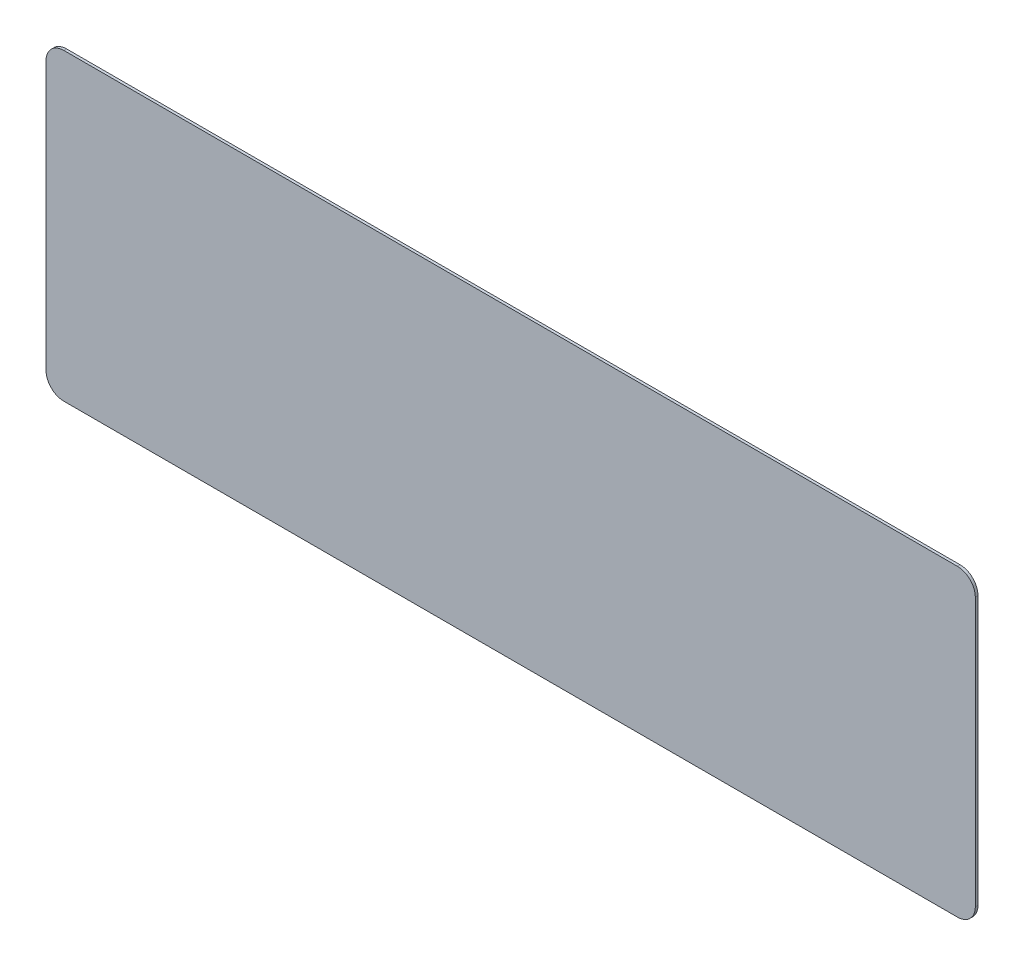
ISO-10303-21;
HEADER;
FILE_DESCRIPTION(('STEP AP214'),'2;1');
FILE_NAME('part.step','',(''),(''),'','','');
FILE_SCHEMA(('AUTOMOTIVE_DESIGN { 1 0 10303 214 1 1 1 1 }'));
ENDSEC;
DATA;
#1=APPLICATION_CONTEXT('core data for automotive mechanical design processes');
#2=APPLICATION_PROTOCOL_DEFINITION('international standard','automotive_design',2000,#1);
#3=PRODUCT_CONTEXT('',#1,'mechanical');
#4=PRODUCT('Part','Part','',(#3));
#5=PRODUCT_RELATED_PRODUCT_CATEGORY('part','',(#4));
#6=PRODUCT_DEFINITION_FORMATION('','',#4);
#7=PRODUCT_DEFINITION_CONTEXT('part definition',#1,'design');
#8=PRODUCT_DEFINITION('design','',#6,#7);
#9=PRODUCT_DEFINITION_SHAPE('','',#8);
#10=(LENGTH_UNIT() NAMED_UNIT(*) SI_UNIT(.MILLI.,.METRE.));
#11=(NAMED_UNIT(*) PLANE_ANGLE_UNIT() SI_UNIT($,.RADIAN.));
#12=(NAMED_UNIT(*) SI_UNIT($,.STERADIAN.) SOLID_ANGLE_UNIT());
#13=UNCERTAINTY_MEASURE_WITH_UNIT(LENGTH_MEASURE(1.E-05),#10,'distance_accuracy_value','');
#14=(GEOMETRIC_REPRESENTATION_CONTEXT(3) GLOBAL_UNCERTAINTY_ASSIGNED_CONTEXT((#13)) GLOBAL_UNIT_ASSIGNED_CONTEXT((#10,
#11,#12)) REPRESENTATION_CONTEXT('',''));
#15=CARTESIAN_POINT('',(0.,0.,0.));
#16=DIRECTION('',(0.,0.,1.));
#17=DIRECTION('',(1.,0.,0.));
#18=AXIS2_PLACEMENT_3D('',#15,#16,#17);
#19=CARTESIAN_POINT('',(-260.,-85.0000000000001,-1.5));
#20=DIRECTION('',(-1.,0.,0.));
#21=DIRECTION('',(0.,0.,1.));
#22=AXIS2_PLACEMENT_3D('',#19,#20,#21);
#23=PLANE('',#22);
#24=DIRECTION('',(0.,-1.,0.));
#25=VECTOR('',#24,1.);
#26=CARTESIAN_POINT('',(-260.,-85.0000000000001,0.));
#27=LINE('',#26,#25);
#28=CARTESIAN_POINT('',(-260.,75.,0.));
#29=VERTEX_POINT('',#28);
#30=CARTESIAN_POINT('',(-260.,-75.0000000000001,0.));
#31=VERTEX_POINT('',#30);
#32=EDGE_CURVE('E111',#29,#31,#27,.T.);
#33=ORIENTED_EDGE('',*,*,#32,.F.);
#34=DIRECTION('',(0.,0.,1.));
#35=VECTOR('',#34,1.);
#36=CARTESIAN_POINT('',(-260.,75.,-1.5));
#37=LINE('',#36,#35);
#38=CARTESIAN_POINT('',(-260.,75.,-1.5));
#39=VERTEX_POINT('',#38);
#40=EDGE_CURVE('E11',#29,#39,#37,.F.);
#41=ORIENTED_EDGE('',*,*,#40,.T.);
#42=DIRECTION('',(0.,-1.,0.));
#43=VECTOR('',#42,1.);
#44=CARTESIAN_POINT('',(-260.,-85.0000000000001,-1.5));
#45=LINE('',#44,#43);
#46=CARTESIAN_POINT('',(-260.,-75.0000000000001,-1.5));
#47=VERTEX_POINT('',#46);
#48=EDGE_CURVE('E161',#39,#47,#45,.T.);
#49=ORIENTED_EDGE('',*,*,#48,.T.);
#50=DIRECTION('',(0.,0.,1.));
#51=VECTOR('',#50,1.);
#52=CARTESIAN_POINT('',(-260.,-75.0000000000001,-1.5));
#53=LINE('',#52,#51);
#54=EDGE_CURVE('E48',#47,#31,#53,.T.);
#55=ORIENTED_EDGE('',*,*,#54,.T.);
#56=EDGE_LOOP('',(#33,#41,#49,#55));
#57=FACE_BOUND('',#56,.T.);
#58=ADVANCED_FACE('F40',(#57),#23,.T.);
#59=CARTESIAN_POINT('',(260.,85.,-1.5));
#60=DIRECTION('',(0.,1.,0.));
#61=DIRECTION('',(-1.,0.,0.));
#62=AXIS2_PLACEMENT_3D('',#59,#60,#61);
#63=PLANE('',#62);
#64=DIRECTION('',(-1.,0.,0.));
#65=VECTOR('',#64,1.);
#66=CARTESIAN_POINT('',(260.,85.,0.));
#67=LINE('',#66,#65);
#68=CARTESIAN_POINT('',(250.,85.,0.));
#69=VERTEX_POINT('',#68);
#70=CARTESIAN_POINT('',(-250.,84.9999999999999,0.));
#71=VERTEX_POINT('',#70);
#72=EDGE_CURVE('E136',#69,#71,#67,.T.);
#73=ORIENTED_EDGE('',*,*,#72,.F.);
#74=DIRECTION('',(0.,0.,1.));
#75=VECTOR('',#74,1.);
#76=CARTESIAN_POINT('',(250.,85.,-1.5));
#77=LINE('',#76,#75);
#78=CARTESIAN_POINT('',(250.,85.,-1.5));
#79=VERTEX_POINT('',#78);
#80=EDGE_CURVE('E62',#69,#79,#77,.F.);
#81=ORIENTED_EDGE('',*,*,#80,.T.);
#82=DIRECTION('',(-1.,0.,0.));
#83=VECTOR('',#82,1.);
#84=CARTESIAN_POINT('',(260.,85.,-1.5));
#85=LINE('',#84,#83);
#86=CARTESIAN_POINT('',(-250.,84.9999999999999,-1.5));
#87=VERTEX_POINT('',#86);
#88=EDGE_CURVE('E130',#79,#87,#85,.T.);
#89=ORIENTED_EDGE('',*,*,#88,.T.);
#90=DIRECTION('',(0.,0.,1.));
#91=VECTOR('',#90,1.);
#92=CARTESIAN_POINT('',(-250.,84.9999999999999,-1.5));
#93=LINE('',#92,#91);
#94=EDGE_CURVE('E155',#87,#71,#93,.T.);
#95=ORIENTED_EDGE('',*,*,#94,.T.);
#96=EDGE_LOOP('',(#73,#81,#89,#95));
#97=FACE_BOUND('',#96,.T.);
#98=ADVANCED_FACE('F193',(#97),#63,.T.);
#99=CARTESIAN_POINT('',(260.,-85.,-1.5));
#100=DIRECTION('',(1.,0.,0.));
#101=DIRECTION('',(0.,0.,-1.));
#102=AXIS2_PLACEMENT_3D('',#99,#100,#101);
#103=PLANE('',#102);
#104=DIRECTION('',(0.,1.,0.));
#105=VECTOR('',#104,1.);
#106=CARTESIAN_POINT('',(260.,-85.,0.));
#107=LINE('',#106,#105);
#108=CARTESIAN_POINT('',(260.,-75.,0.));
#109=VERTEX_POINT('',#108);
#110=CARTESIAN_POINT('',(260.,75.,0.));
#111=VERTEX_POINT('',#110);
#112=EDGE_CURVE('E126',#109,#111,#107,.T.);
#113=ORIENTED_EDGE('',*,*,#112,.F.);
#114=DIRECTION('',(0.,0.,1.));
#115=VECTOR('',#114,1.);
#116=CARTESIAN_POINT('',(260.,-75.,-1.5));
#117=LINE('',#116,#115);
#118=CARTESIAN_POINT('',(260.,-75.,-1.5));
#119=VERTEX_POINT('',#118);
#120=EDGE_CURVE('E147',#109,#119,#117,.F.);
#121=ORIENTED_EDGE('',*,*,#120,.T.);
#122=DIRECTION('',(0.,1.,0.));
#123=VECTOR('',#122,1.);
#124=CARTESIAN_POINT('',(260.,-85.,-1.5));
#125=LINE('',#124,#123);
#126=CARTESIAN_POINT('',(260.,75.,-1.5));
#127=VERTEX_POINT('',#126);
#128=EDGE_CURVE('E133',#119,#127,#125,.T.);
#129=ORIENTED_EDGE('',*,*,#128,.T.);
#130=DIRECTION('',(0.,0.,1.));
#131=VECTOR('',#130,1.);
#132=CARTESIAN_POINT('',(260.,75.,-1.5));
#133=LINE('',#132,#131);
#134=EDGE_CURVE('E144',#127,#111,#133,.T.);
#135=ORIENTED_EDGE('',*,*,#134,.T.);
#136=EDGE_LOOP('',(#113,#121,#129,#135));
#137=FACE_BOUND('',#136,.T.);
#138=ADVANCED_FACE('F173',(#137),#103,.T.);
#139=CARTESIAN_POINT('',(260.,-85.,-1.5));
#140=DIRECTION('',(0.,-1.,0.));
#141=DIRECTION('',(1.,0.,0.));
#142=AXIS2_PLACEMENT_3D('',#139,#140,#141);
#143=PLANE('',#142);
#144=DIRECTION('',(1.,0.,0.));
#145=VECTOR('',#144,1.);
#146=CARTESIAN_POINT('',(260.,-85.,-1.5));
#147=LINE('',#146,#145);
#148=CARTESIAN_POINT('',(-250.,-85.0000000000001,-1.5));
#149=VERTEX_POINT('',#148);
#150=CARTESIAN_POINT('',(250.,-85.,-1.5));
#151=VERTEX_POINT('',#150);
#152=EDGE_CURVE('E162',#149,#151,#147,.T.);
#153=ORIENTED_EDGE('',*,*,#152,.T.);
#154=DIRECTION('',(0.,0.,1.));
#155=VECTOR('',#154,1.);
#156=CARTESIAN_POINT('',(250.,-85.,-1.5));
#157=LINE('',#156,#155);
#158=CARTESIAN_POINT('',(250.,-85.,0.));
#159=VERTEX_POINT('',#158);
#160=EDGE_CURVE('E117',#151,#159,#157,.T.);
#161=ORIENTED_EDGE('',*,*,#160,.T.);
#162=DIRECTION('',(1.,0.,0.));
#163=VECTOR('',#162,1.);
#164=CARTESIAN_POINT('',(260.,-85.,0.));
#165=LINE('',#164,#163);
#166=CARTESIAN_POINT('',(-250.,-85.0000000000001,0.));
#167=VERTEX_POINT('',#166);
#168=EDGE_CURVE('E109',#167,#159,#165,.T.);
#169=ORIENTED_EDGE('',*,*,#168,.F.);
#170=DIRECTION('',(0.,0.,1.));
#171=VECTOR('',#170,1.);
#172=CARTESIAN_POINT('',(-250.,-85.0000000000001,-1.5));
#173=LINE('',#172,#171);
#174=EDGE_CURVE('E123',#167,#149,#173,.F.);
#175=ORIENTED_EDGE('',*,*,#174,.T.);
#176=EDGE_LOOP('',(#153,#161,#169,#175));
#177=FACE_BOUND('',#176,.T.);
#178=ADVANCED_FACE('F122',(#177),#143,.T.);
#179=CARTESIAN_POINT('',(0.,0.,-1.5));
#180=DIRECTION('',(0.,0.,1.));
#181=DIRECTION('',(1.,0.,0.));
#182=AXIS2_PLACEMENT_3D('',#179,#180,#181);
#183=PLANE('',#182);
#184=ORIENTED_EDGE('',*,*,#128,.F.);
#185=CARTESIAN_POINT('',(250.,-75.,-1.5));
#186=DIRECTION('',(0.,0.,1.));
#187=DIRECTION('',(1.,0.,0.));
#188=AXIS2_PLACEMENT_3D('',#185,#186,#187);
#189=CIRCLE('',#188,10.);
#190=EDGE_CURVE('E153',#119,#151,#189,.F.);
#191=ORIENTED_EDGE('',*,*,#190,.T.);
#192=ORIENTED_EDGE('',*,*,#152,.F.);
#193=CARTESIAN_POINT('',(-250.,-75.0000000000001,-1.5));
#194=DIRECTION('',(0.,0.,1.));
#195=DIRECTION('',(1.,0.,0.));
#196=AXIS2_PLACEMENT_3D('',#193,#194,#195);
#197=CIRCLE('',#196,10.);
#198=EDGE_CURVE('E129',#149,#47,#197,.F.);
#199=ORIENTED_EDGE('',*,*,#198,.T.);
#200=ORIENTED_EDGE('',*,*,#48,.F.);
#201=CARTESIAN_POINT('',(-250.,74.9999999999999,-1.5));
#202=DIRECTION('',(0.,0.,1.));
#203=DIRECTION('',(1.,0.,0.));
#204=AXIS2_PLACEMENT_3D('',#201,#202,#203);
#205=CIRCLE('',#204,10.);
#206=EDGE_CURVE('E55',#39,#87,#205,.F.);
#207=ORIENTED_EDGE('',*,*,#206,.T.);
#208=ORIENTED_EDGE('',*,*,#88,.F.);
#209=CARTESIAN_POINT('',(250.,75.,-1.5));
#210=DIRECTION('',(0.,0.,1.));
#211=DIRECTION('',(1.,0.,0.));
#212=AXIS2_PLACEMENT_3D('',#209,#210,#211);
#213=CIRCLE('',#212,10.);
#214=EDGE_CURVE('E151',#79,#127,#213,.F.);
#215=ORIENTED_EDGE('',*,*,#214,.T.);
#216=EDGE_LOOP('',(#184,#191,#192,#199,#200,#207,#208,#215));
#217=FACE_BOUND('',#216,.T.);
#218=ADVANCED_FACE('F179',(#217),#183,.F.);
#219=CARTESIAN_POINT('',(0.,0.,0.));
#220=DIRECTION('',(0.,0.,1.));
#221=DIRECTION('',(1.,0.,0.));
#222=AXIS2_PLACEMENT_3D('',#219,#220,#221);
#223=PLANE('',#222);
#224=ORIENTED_EDGE('',*,*,#168,.T.);
#225=CARTESIAN_POINT('',(250.,-75.,0.));
#226=DIRECTION('',(0.,0.,1.));
#227=DIRECTION('',(1.,0.,0.));
#228=AXIS2_PLACEMENT_3D('',#225,#226,#227);
#229=CIRCLE('',#228,10.);
#230=EDGE_CURVE('E142',#159,#109,#229,.T.);
#231=ORIENTED_EDGE('',*,*,#230,.T.);
#232=ORIENTED_EDGE('',*,*,#112,.T.);
#233=CARTESIAN_POINT('',(250.,75.,0.));
#234=DIRECTION('',(0.,0.,1.));
#235=DIRECTION('',(1.,0.,0.));
#236=AXIS2_PLACEMENT_3D('',#233,#234,#235);
#237=CIRCLE('',#236,10.);
#238=EDGE_CURVE('E140',#111,#69,#237,.T.);
#239=ORIENTED_EDGE('',*,*,#238,.T.);
#240=ORIENTED_EDGE('',*,*,#72,.T.);
#241=CARTESIAN_POINT('',(-250.,74.9999999999999,0.));
#242=DIRECTION('',(0.,0.,1.));
#243=DIRECTION('',(1.,0.,0.));
#244=AXIS2_PLACEMENT_3D('',#241,#242,#243);
#245=CIRCLE('',#244,10.);
#246=EDGE_CURVE('E116',#71,#29,#245,.T.);
#247=ORIENTED_EDGE('',*,*,#246,.T.);
#248=ORIENTED_EDGE('',*,*,#32,.T.);
#249=CARTESIAN_POINT('',(-250.,-75.0000000000001,0.));
#250=DIRECTION('',(0.,0.,1.));
#251=DIRECTION('',(1.,0.,0.));
#252=AXIS2_PLACEMENT_3D('',#249,#250,#251);
#253=CIRCLE('',#252,10.);
#254=EDGE_CURVE('E106',#31,#167,#253,.T.);
#255=ORIENTED_EDGE('',*,*,#254,.T.);
#256=EDGE_LOOP('',(#224,#231,#232,#239,#240,#247,#248,#255));
#257=FACE_BOUND('',#256,.T.);
#258=ADVANCED_FACE('F108',(#257),#223,.T.);
#259=CARTESIAN_POINT('',(250.,-75.,-1.5));
#260=DIRECTION('',(0.,0.,1.));
#261=DIRECTION('',(1.,0.,0.));
#262=AXIS2_PLACEMENT_3D('',#259,#260,#261);
#263=CYLINDRICAL_SURFACE('',#262,10.);
#264=ORIENTED_EDGE('',*,*,#190,.F.);
#265=ORIENTED_EDGE('',*,*,#120,.F.);
#266=ORIENTED_EDGE('',*,*,#230,.F.);
#267=ORIENTED_EDGE('',*,*,#160,.F.);
#268=EDGE_LOOP('',(#264,#265,#266,#267));
#269=FACE_BOUND('',#268,.T.);
#270=ADVANCED_FACE('F178',(#269),#263,.T.);
#271=CARTESIAN_POINT('',(250.,75.,-1.5));
#272=DIRECTION('',(0.,0.,1.));
#273=DIRECTION('',(1.,0.,0.));
#274=AXIS2_PLACEMENT_3D('',#271,#272,#273);
#275=CYLINDRICAL_SURFACE('',#274,10.);
#276=ORIENTED_EDGE('',*,*,#214,.F.);
#277=ORIENTED_EDGE('',*,*,#80,.F.);
#278=ORIENTED_EDGE('',*,*,#238,.F.);
#279=ORIENTED_EDGE('',*,*,#134,.F.);
#280=EDGE_LOOP('',(#276,#277,#278,#279));
#281=FACE_BOUND('',#280,.T.);
#282=ADVANCED_FACE('F182',(#281),#275,.T.);
#283=CARTESIAN_POINT('',(-250.,74.9999999999999,-1.5));
#284=DIRECTION('',(0.,0.,1.));
#285=DIRECTION('',(1.,0.,0.));
#286=AXIS2_PLACEMENT_3D('',#283,#284,#285);
#287=CYLINDRICAL_SURFACE('',#286,10.);
#288=ORIENTED_EDGE('',*,*,#206,.F.);
#289=ORIENTED_EDGE('',*,*,#40,.F.);
#290=ORIENTED_EDGE('',*,*,#246,.F.);
#291=ORIENTED_EDGE('',*,*,#94,.F.);
#292=EDGE_LOOP('',(#288,#289,#290,#291));
#293=FACE_BOUND('',#292,.T.);
#294=ADVANCED_FACE('F184',(#293),#287,.T.);
#295=CARTESIAN_POINT('',(-250.,-75.0000000000001,-1.5));
#296=DIRECTION('',(0.,0.,1.));
#297=DIRECTION('',(1.,0.,0.));
#298=AXIS2_PLACEMENT_3D('',#295,#296,#297);
#299=CYLINDRICAL_SURFACE('',#298,10.);
#300=ORIENTED_EDGE('',*,*,#198,.F.);
#301=ORIENTED_EDGE('',*,*,#174,.F.);
#302=ORIENTED_EDGE('',*,*,#254,.F.);
#303=ORIENTED_EDGE('',*,*,#54,.F.);
#304=EDGE_LOOP('',(#300,#301,#302,#303));
#305=FACE_BOUND('',#304,.T.);
#306=ADVANCED_FACE('F42',(#305),#299,.T.);
#307=CLOSED_SHELL('',(#58,#98,#138,#178,#218,#258,#270,#282,#294,#306));
#308=MANIFOLD_SOLID_BREP('B2',#307);
#309=ADVANCED_BREP_SHAPE_REPRESENTATION('',(#18,#308),#14);
#310=SHAPE_DEFINITION_REPRESENTATION(#9,#309);
ENDSEC;
END-ISO-10303-21;
